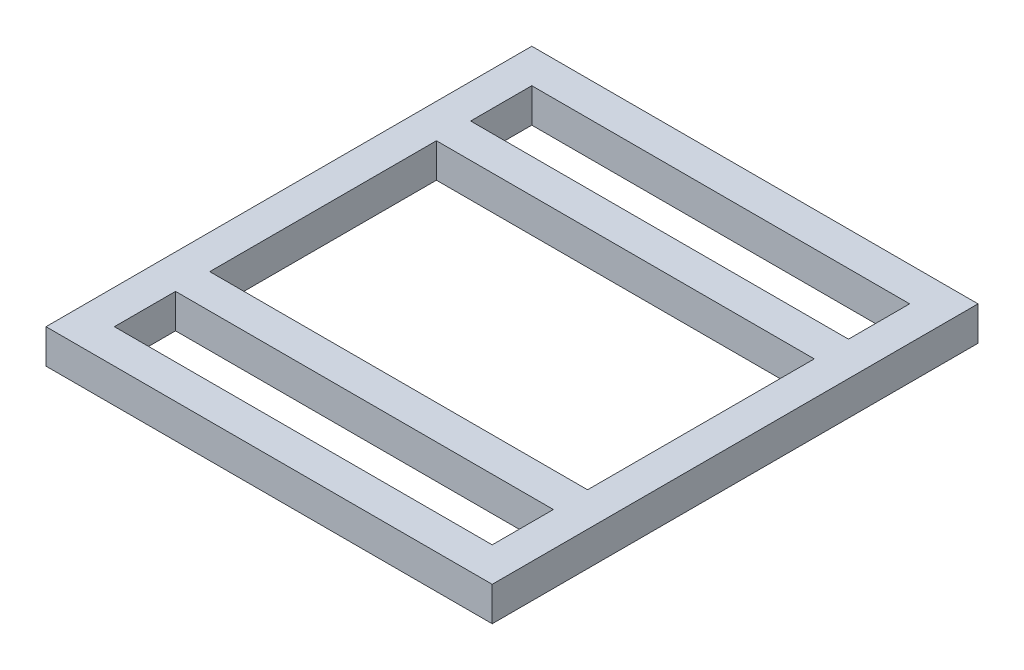
ISO-10303-21;
HEADER;
FILE_DESCRIPTION(('STEP AP214'),'2;1');
FILE_NAME('part.step','',(''),(''),'','','');
FILE_SCHEMA(('AUTOMOTIVE_DESIGN { 1 0 10303 214 1 1 1 1 }'));
ENDSEC;
DATA;
#1=APPLICATION_CONTEXT('core data for automotive mechanical design processes');
#2=APPLICATION_PROTOCOL_DEFINITION('international standard','automotive_design',2000,#1);
#3=PRODUCT_CONTEXT('',#1,'mechanical');
#4=PRODUCT('Part','Part','',(#3));
#5=PRODUCT_RELATED_PRODUCT_CATEGORY('part','',(#4));
#6=PRODUCT_DEFINITION_FORMATION('','',#4);
#7=PRODUCT_DEFINITION_CONTEXT('part definition',#1,'design');
#8=PRODUCT_DEFINITION('design','',#6,#7);
#9=PRODUCT_DEFINITION_SHAPE('','',#8);
#10=(LENGTH_UNIT() NAMED_UNIT(*) SI_UNIT(.MILLI.,.METRE.));
#11=(NAMED_UNIT(*) PLANE_ANGLE_UNIT() SI_UNIT($,.RADIAN.));
#12=(NAMED_UNIT(*) SI_UNIT($,.STERADIAN.) SOLID_ANGLE_UNIT());
#13=UNCERTAINTY_MEASURE_WITH_UNIT(LENGTH_MEASURE(1.E-05),#10,'distance_accuracy_value','');
#14=(GEOMETRIC_REPRESENTATION_CONTEXT(3) GLOBAL_UNCERTAINTY_ASSIGNED_CONTEXT((#13)) GLOBAL_UNIT_ASSIGNED_CONTEXT((#10,
#11,#12)) REPRESENTATION_CONTEXT('',''));
#15=CARTESIAN_POINT('',(0.,0.,0.));
#16=DIRECTION('',(0.,0.,1.));
#17=DIRECTION('',(1.,0.,0.));
#18=AXIS2_PLACEMENT_3D('',#15,#16,#17);
#19=CARTESIAN_POINT('',(0.,19.,0.));
#20=DIRECTION('',(0.,1.,0.));
#21=DIRECTION('',(0.,0.,1.));
#22=AXIS2_PLACEMENT_3D('',#19,#20,#21);
#23=PLANE('',#22);
#24=DIRECTION('',(-1.,0.,0.));
#25=VECTOR('',#24,1.);
#26=CARTESIAN_POINT('',(-25.3350305953817,19.,-191.764705882353));
#27=LINE('',#26,#25);
#28=CARTESIAN_POINT('',(203.664969404618,19.,-191.764705882353));
#29=VERTEX_POINT('',#28);
#30=CARTESIAN_POINT('',(-44.3350305953817,19.,-191.764705882353));
#31=VERTEX_POINT('',#30);
#32=EDGE_CURVE('E248',#29,#31,#27,.T.);
#33=ORIENTED_EDGE('',*,*,#32,.T.);
#34=DIRECTION('',(0.,0.,1.));
#35=VECTOR('',#34,1.);
#36=CARTESIAN_POINT('',(-44.3350305953817,19.,-191.764705882353));
#37=LINE('',#36,#35);
#38=CARTESIAN_POINT('',(-44.3350305953816,19.,78.235294117647));
#39=VERTEX_POINT('',#38);
#40=EDGE_CURVE('E251',#31,#39,#37,.T.);
#41=ORIENTED_EDGE('',*,*,#40,.T.);
#42=DIRECTION('',(1.,0.,0.));
#43=VECTOR('',#42,1.);
#44=CARTESIAN_POINT('',(-44.3350305953816,19.,78.235294117647));
#45=LINE('',#44,#43);
#46=CARTESIAN_POINT('',(203.664969404618,19.,78.235294117647));
#47=VERTEX_POINT('',#46);
#48=EDGE_CURVE('E254',#39,#47,#45,.T.);
#49=ORIENTED_EDGE('',*,*,#48,.T.);
#50=DIRECTION('',(0.,0.,-1.));
#51=VECTOR('',#50,1.);
#52=CARTESIAN_POINT('',(203.664969404618,19.,78.235294117647));
#53=LINE('',#52,#51);
#54=EDGE_CURVE('E256',#47,#29,#53,.T.);
#55=ORIENTED_EDGE('',*,*,#54,.T.);
#56=EDGE_LOOP('',(#33,#41,#49,#55));
#57=FACE_BOUND('',#56,.T.);
#58=DIRECTION('',(0.,0.,1.));
#59=VECTOR('',#58,1.);
#60=CARTESIAN_POINT('',(-25.3350305953816,19.,59.235294117647));
#61=LINE('',#60,#59);
#62=CARTESIAN_POINT('',(-25.3350305953816,19.,25.235294117647));
#63=VERTEX_POINT('',#62);
#64=CARTESIAN_POINT('',(-25.3350305953816,19.,59.235294117647));
#65=VERTEX_POINT('',#64);
#66=EDGE_CURVE('E219',#63,#65,#61,.T.);
#67=ORIENTED_EDGE('',*,*,#66,.F.);
#68=DIRECTION('',(-1.,0.,0.));
#69=VECTOR('',#68,1.);
#70=CARTESIAN_POINT('',(-25.3350305953816,19.,25.235294117647));
#71=LINE('',#70,#69);
#72=CARTESIAN_POINT('',(184.664969404618,19.,25.235294117647));
#73=VERTEX_POINT('',#72);
#74=EDGE_CURVE('E217',#73,#63,#71,.T.);
#75=ORIENTED_EDGE('',*,*,#74,.F.);
#76=DIRECTION('',(0.,0.,-1.));
#77=VECTOR('',#76,1.);
#78=CARTESIAN_POINT('',(184.664969404618,19.,25.235294117647));
#79=LINE('',#78,#77);
#80=CARTESIAN_POINT('',(184.664969404618,19.,59.235294117647));
#81=VERTEX_POINT('',#80);
#82=EDGE_CURVE('E225',#81,#73,#79,.T.);
#83=ORIENTED_EDGE('',*,*,#82,.F.);
#84=DIRECTION('',(1.,0.,0.));
#85=VECTOR('',#84,1.);
#86=CARTESIAN_POINT('',(184.664969404618,19.,59.235294117647));
#87=LINE('',#86,#85);
#88=EDGE_CURVE('E222',#65,#81,#87,.T.);
#89=ORIENTED_EDGE('',*,*,#88,.F.);
#90=EDGE_LOOP('',(#67,#75,#83,#89));
#91=FACE_BOUND('',#90,.T.);
#92=DIRECTION('',(0.,0.,-1.));
#93=VECTOR('',#92,1.);
#94=CARTESIAN_POINT('',(184.664969404618,19.,-172.764705882353));
#95=LINE('',#94,#93);
#96=CARTESIAN_POINT('',(184.664969404618,19.,-138.764705882353));
#97=VERTEX_POINT('',#96);
#98=CARTESIAN_POINT('',(184.664969404618,19.,-172.764705882353));
#99=VERTEX_POINT('',#98);
#100=EDGE_CURVE('E188',#97,#99,#95,.T.);
#101=ORIENTED_EDGE('',*,*,#100,.F.);
#102=DIRECTION('',(1.,0.,0.));
#103=VECTOR('',#102,1.);
#104=CARTESIAN_POINT('',(184.664969404618,19.,-138.764705882353));
#105=LINE('',#104,#103);
#106=CARTESIAN_POINT('',(-25.3350305953817,19.,-138.764705882353));
#107=VERTEX_POINT('',#106);
#108=EDGE_CURVE('E186',#107,#97,#105,.T.);
#109=ORIENTED_EDGE('',*,*,#108,.F.);
#110=DIRECTION('',(0.,0.,1.));
#111=VECTOR('',#110,1.);
#112=CARTESIAN_POINT('',(-25.3350305953817,19.,-138.764705882353));
#113=LINE('',#112,#111);
#114=CARTESIAN_POINT('',(-25.3350305953817,19.,-172.764705882353));
#115=VERTEX_POINT('',#114);
#116=EDGE_CURVE('E194',#115,#107,#113,.T.);
#117=ORIENTED_EDGE('',*,*,#116,.F.);
#118=DIRECTION('',(-1.,0.,0.));
#119=VECTOR('',#118,1.);
#120=CARTESIAN_POINT('',(-25.3350305953817,19.,-172.764705882353));
#121=LINE('',#120,#119);
#122=EDGE_CURVE('E191',#99,#115,#121,.T.);
#123=ORIENTED_EDGE('',*,*,#122,.F.);
#124=EDGE_LOOP('',(#101,#109,#117,#123));
#125=FACE_BOUND('',#124,.T.);
#126=DIRECTION('',(1.,0.,0.));
#127=VECTOR('',#126,1.);
#128=CARTESIAN_POINT('',(184.664969404618,19.,6.23529411764704));
#129=LINE('',#128,#127);
#130=CARTESIAN_POINT('',(-25.3350305953817,19.,6.23529411764707));
#131=VERTEX_POINT('',#130);
#132=CARTESIAN_POINT('',(184.664969404618,19.,6.23529411764704));
#133=VERTEX_POINT('',#132);
#134=EDGE_CURVE('E158',#131,#133,#129,.T.);
#135=ORIENTED_EDGE('',*,*,#134,.F.);
#136=DIRECTION('',(0.,0.,1.));
#137=VECTOR('',#136,1.);
#138=CARTESIAN_POINT('',(-25.3350305953817,19.,6.23529411764707));
#139=LINE('',#138,#137);
#140=CARTESIAN_POINT('',(-25.3350305953816,19.,-119.764705882353));
#141=VERTEX_POINT('',#140);
#142=EDGE_CURVE('E150',#141,#131,#139,.T.);
#143=ORIENTED_EDGE('',*,*,#142,.F.);
#144=DIRECTION('',(-1.,0.,0.));
#145=VECTOR('',#144,1.);
#146=CARTESIAN_POINT('',(-25.3350305953816,19.,-119.764705882353));
#147=LINE('',#146,#145);
#148=CARTESIAN_POINT('',(184.664969404618,19.,-119.764705882353));
#149=VERTEX_POINT('',#148);
#150=EDGE_CURVE('E172',#149,#141,#147,.T.);
#151=ORIENTED_EDGE('',*,*,#150,.F.);
#152=DIRECTION('',(0.,0.,-1.));
#153=VECTOR('',#152,1.);
#154=CARTESIAN_POINT('',(184.664969404618,19.,-119.764705882353));
#155=LINE('',#154,#153);
#156=EDGE_CURVE('E170',#133,#149,#155,.T.);
#157=ORIENTED_EDGE('',*,*,#156,.F.);
#158=EDGE_LOOP('',(#135,#143,#151,#157));
#159=FACE_BOUND('',#158,.T.);
#160=ADVANCED_FACE('F37',(#57,#91,#125,#159),#23,.T.);
#161=CARTESIAN_POINT('',(0.,0.,0.));
#162=DIRECTION('',(0.,1.,0.));
#163=DIRECTION('',(0.,0.,1.));
#164=AXIS2_PLACEMENT_3D('',#161,#162,#163);
#165=PLANE('',#164);
#166=DIRECTION('',(1.,0.,0.));
#167=VECTOR('',#166,1.);
#168=CARTESIAN_POINT('',(184.664969404618,0.,-138.764705882353));
#169=LINE('',#168,#167);
#170=CARTESIAN_POINT('',(-25.3350305953817,0.,-138.764705882353));
#171=VERTEX_POINT('',#170);
#172=CARTESIAN_POINT('',(184.664969404618,0.,-138.764705882353));
#173=VERTEX_POINT('',#172);
#174=EDGE_CURVE('E166',#171,#173,#169,.T.);
#175=ORIENTED_EDGE('',*,*,#174,.T.);
#176=DIRECTION('',(0.,0.,-1.));
#177=VECTOR('',#176,1.);
#178=CARTESIAN_POINT('',(184.664969404618,0.,-172.764705882353));
#179=LINE('',#178,#177);
#180=CARTESIAN_POINT('',(184.664969404618,0.,-172.764705882353));
#181=VERTEX_POINT('',#180);
#182=EDGE_CURVE('E199',#173,#181,#179,.T.);
#183=ORIENTED_EDGE('',*,*,#182,.T.);
#184=DIRECTION('',(-1.,0.,0.));
#185=VECTOR('',#184,1.);
#186=CARTESIAN_POINT('',(-25.3350305953817,0.,-172.764705882353));
#187=LINE('',#186,#185);
#188=CARTESIAN_POINT('',(-25.3350305953817,0.,-172.764705882353));
#189=VERTEX_POINT('',#188);
#190=EDGE_CURVE('E202',#181,#189,#187,.T.);
#191=ORIENTED_EDGE('',*,*,#190,.T.);
#192=DIRECTION('',(0.,0.,1.));
#193=VECTOR('',#192,1.);
#194=CARTESIAN_POINT('',(-25.3350305953817,0.,-138.764705882353));
#195=LINE('',#194,#193);
#196=EDGE_CURVE('E189',#189,#171,#195,.T.);
#197=ORIENTED_EDGE('',*,*,#196,.T.);
#198=EDGE_LOOP('',(#175,#183,#191,#197));
#199=FACE_BOUND('',#198,.T.);
#200=DIRECTION('',(0.,0.,1.));
#201=VECTOR('',#200,1.);
#202=CARTESIAN_POINT('',(-44.3350305953817,0.,-191.764705882353));
#203=LINE('',#202,#201);
#204=CARTESIAN_POINT('',(-44.3350305953817,0.,-191.764705882353));
#205=VERTEX_POINT('',#204);
#206=CARTESIAN_POINT('',(-44.3350305953816,0.,78.235294117647));
#207=VERTEX_POINT('',#206);
#208=EDGE_CURVE('E247',#205,#207,#203,.T.);
#209=ORIENTED_EDGE('',*,*,#208,.F.);
#210=DIRECTION('',(-1.,0.,0.));
#211=VECTOR('',#210,1.);
#212=CARTESIAN_POINT('',(-25.3350305953817,0.,-191.764705882353));
#213=LINE('',#212,#211);
#214=CARTESIAN_POINT('',(203.664969404618,0.,-191.764705882353));
#215=VERTEX_POINT('',#214);
#216=EDGE_CURVE('E252',#215,#205,#213,.T.);
#217=ORIENTED_EDGE('',*,*,#216,.F.);
#218=DIRECTION('',(0.,0.,-1.));
#219=VECTOR('',#218,1.);
#220=CARTESIAN_POINT('',(203.664969404618,0.,78.235294117647));
#221=LINE('',#220,#219);
#222=CARTESIAN_POINT('',(203.664969404618,0.,78.235294117647));
#223=VERTEX_POINT('',#222);
#224=EDGE_CURVE('E264',#223,#215,#221,.T.);
#225=ORIENTED_EDGE('',*,*,#224,.F.);
#226=DIRECTION('',(1.,0.,0.));
#227=VECTOR('',#226,1.);
#228=CARTESIAN_POINT('',(184.664969404618,0.,78.235294117647));
#229=LINE('',#228,#227);
#230=EDGE_CURVE('E262',#207,#223,#229,.T.);
#231=ORIENTED_EDGE('',*,*,#230,.F.);
#232=EDGE_LOOP('',(#209,#217,#225,#231));
#233=FACE_BOUND('',#232,.T.);
#234=DIRECTION('',(-1.,0.,0.));
#235=VECTOR('',#234,1.);
#236=CARTESIAN_POINT('',(-25.3350305953816,0.,25.235294117647));
#237=LINE('',#236,#235);
#238=CARTESIAN_POINT('',(184.664969404618,0.,25.235294117647));
#239=VERTEX_POINT('',#238);
#240=CARTESIAN_POINT('',(-25.3350305953816,0.,25.235294117647));
#241=VERTEX_POINT('',#240);
#242=EDGE_CURVE('E216',#239,#241,#237,.T.);
#243=ORIENTED_EDGE('',*,*,#242,.T.);
#244=DIRECTION('',(0.,0.,1.));
#245=VECTOR('',#244,1.);
#246=CARTESIAN_POINT('',(-25.3350305953816,0.,59.235294117647));
#247=LINE('',#246,#245);
#248=CARTESIAN_POINT('',(-25.3350305953816,0.,59.235294117647));
#249=VERTEX_POINT('',#248);
#250=EDGE_CURVE('E230',#241,#249,#247,.T.);
#251=ORIENTED_EDGE('',*,*,#250,.T.);
#252=DIRECTION('',(1.,0.,0.));
#253=VECTOR('',#252,1.);
#254=CARTESIAN_POINT('',(184.664969404618,0.,59.235294117647));
#255=LINE('',#254,#253);
#256=CARTESIAN_POINT('',(184.664969404618,0.,59.235294117647));
#257=VERTEX_POINT('',#256);
#258=EDGE_CURVE('E233',#249,#257,#255,.T.);
#259=ORIENTED_EDGE('',*,*,#258,.T.);
#260=DIRECTION('',(0.,0.,-1.));
#261=VECTOR('',#260,1.);
#262=CARTESIAN_POINT('',(184.664969404618,0.,25.235294117647));
#263=LINE('',#262,#261);
#264=EDGE_CURVE('E220',#257,#239,#263,.T.);
#265=ORIENTED_EDGE('',*,*,#264,.T.);
#266=EDGE_LOOP('',(#243,#251,#259,#265));
#267=FACE_BOUND('',#266,.T.);
#268=DIRECTION('',(0.,0.,1.));
#269=VECTOR('',#268,1.);
#270=CARTESIAN_POINT('',(-25.3350305953817,0.,6.23529411764707));
#271=LINE('',#270,#269);
#272=CARTESIAN_POINT('',(-25.3350305953816,0.,-119.764705882353));
#273=VERTEX_POINT('',#272);
#274=CARTESIAN_POINT('',(-25.3350305953817,0.,6.23529411764707));
#275=VERTEX_POINT('',#274);
#276=EDGE_CURVE('E60',#273,#275,#271,.T.);
#277=ORIENTED_EDGE('',*,*,#276,.T.);
#278=DIRECTION('',(1.,0.,0.));
#279=VECTOR('',#278,1.);
#280=CARTESIAN_POINT('',(184.664969404618,0.,6.23529411764704));
#281=LINE('',#280,#279);
#282=CARTESIAN_POINT('',(184.664969404618,0.,6.23529411764704));
#283=VERTEX_POINT('',#282);
#284=EDGE_CURVE('E165',#275,#283,#281,.T.);
#285=ORIENTED_EDGE('',*,*,#284,.T.);
#286=DIRECTION('',(0.,0.,-1.));
#287=VECTOR('',#286,1.);
#288=CARTESIAN_POINT('',(184.664969404618,0.,-119.764705882353));
#289=LINE('',#288,#287);
#290=CARTESIAN_POINT('',(184.664969404618,0.,-119.764705882353));
#291=VERTEX_POINT('',#290);
#292=EDGE_CURVE('E178',#283,#291,#289,.T.);
#293=ORIENTED_EDGE('',*,*,#292,.T.);
#294=DIRECTION('',(-1.,0.,0.));
#295=VECTOR('',#294,1.);
#296=CARTESIAN_POINT('',(-25.3350305953816,0.,-119.764705882353));
#297=LINE('',#296,#295);
#298=EDGE_CURVE('E159',#291,#273,#297,.T.);
#299=ORIENTED_EDGE('',*,*,#298,.T.);
#300=EDGE_LOOP('',(#277,#285,#293,#299));
#301=FACE_BOUND('',#300,.T.);
#302=ADVANCED_FACE('F282',(#199,#233,#267,#301),#165,.F.);
#303=CARTESIAN_POINT('',(-44.3350305953817,19.,-191.764705882353));
#304=DIRECTION('',(1.,0.,0.));
#305=DIRECTION('',(0.,0.,-1.));
#306=AXIS2_PLACEMENT_3D('',#303,#304,#305);
#307=PLANE('',#306);
#308=ORIENTED_EDGE('',*,*,#208,.T.);
#309=DIRECTION('',(0.,-1.,0.));
#310=VECTOR('',#309,1.);
#311=CARTESIAN_POINT('',(-44.3350305953816,19.,78.235294117647));
#312=LINE('',#311,#310);
#313=EDGE_CURVE('E45',#39,#207,#312,.T.);
#314=ORIENTED_EDGE('',*,*,#313,.F.);
#315=ORIENTED_EDGE('',*,*,#40,.F.);
#316=DIRECTION('',(0.,-1.,0.));
#317=VECTOR('',#316,1.);
#318=CARTESIAN_POINT('',(-44.3350305953817,19.,-191.764705882353));
#319=LINE('',#318,#317);
#320=EDGE_CURVE('E11',#31,#205,#319,.T.);
#321=ORIENTED_EDGE('',*,*,#320,.T.);
#322=EDGE_LOOP('',(#308,#314,#315,#321));
#323=FACE_BOUND('',#322,.T.);
#324=ADVANCED_FACE('F39',(#323),#307,.F.);
#325=CARTESIAN_POINT('',(184.664969404618,19.,78.235294117647));
#326=DIRECTION('',(0.,0.,-1.));
#327=DIRECTION('',(-1.,0.,0.));
#328=AXIS2_PLACEMENT_3D('',#325,#326,#327);
#329=PLANE('',#328);
#330=ORIENTED_EDGE('',*,*,#230,.T.);
#331=DIRECTION('',(0.,-1.,0.));
#332=VECTOR('',#331,1.);
#333=CARTESIAN_POINT('',(203.664969404618,19.,78.235294117647));
#334=LINE('',#333,#332);
#335=EDGE_CURVE('E270',#47,#223,#334,.T.);
#336=ORIENTED_EDGE('',*,*,#335,.F.);
#337=ORIENTED_EDGE('',*,*,#48,.F.);
#338=ORIENTED_EDGE('',*,*,#313,.T.);
#339=EDGE_LOOP('',(#330,#336,#337,#338));
#340=FACE_BOUND('',#339,.T.);
#341=ADVANCED_FACE('F276',(#340),#329,.F.);
#342=CARTESIAN_POINT('',(203.664969404618,19.,78.235294117647));
#343=DIRECTION('',(-1.,0.,0.));
#344=DIRECTION('',(0.,0.,1.));
#345=AXIS2_PLACEMENT_3D('',#342,#343,#344);
#346=PLANE('',#345);
#347=ORIENTED_EDGE('',*,*,#224,.T.);
#348=DIRECTION('',(0.,-1.,0.));
#349=VECTOR('',#348,1.);
#350=CARTESIAN_POINT('',(203.664969404618,19.,-191.764705882353));
#351=LINE('',#350,#349);
#352=EDGE_CURVE('E259',#29,#215,#351,.T.);
#353=ORIENTED_EDGE('',*,*,#352,.F.);
#354=ORIENTED_EDGE('',*,*,#54,.F.);
#355=ORIENTED_EDGE('',*,*,#335,.T.);
#356=EDGE_LOOP('',(#347,#353,#354,#355));
#357=FACE_BOUND('',#356,.T.);
#358=ADVANCED_FACE('F287',(#357),#346,.F.);
#359=CARTESIAN_POINT('',(-25.3350305953817,19.,-191.764705882353));
#360=DIRECTION('',(0.,0.,1.));
#361=DIRECTION('',(1.,0.,0.));
#362=AXIS2_PLACEMENT_3D('',#359,#360,#361);
#363=PLANE('',#362);
#364=ORIENTED_EDGE('',*,*,#216,.T.);
#365=ORIENTED_EDGE('',*,*,#320,.F.);
#366=ORIENTED_EDGE('',*,*,#32,.F.);
#367=ORIENTED_EDGE('',*,*,#352,.T.);
#368=EDGE_LOOP('',(#364,#365,#366,#367));
#369=FACE_BOUND('',#368,.T.);
#370=ADVANCED_FACE('F290',(#369),#363,.F.);
#371=CARTESIAN_POINT('',(-25.3350305953816,19.,25.235294117647));
#372=DIRECTION('',(0.,0.,1.));
#373=DIRECTION('',(1.,0.,0.));
#374=AXIS2_PLACEMENT_3D('',#371,#372,#373);
#375=PLANE('',#374);
#376=ORIENTED_EDGE('',*,*,#242,.F.);
#377=DIRECTION('',(0.,-1.,0.));
#378=VECTOR('',#377,1.);
#379=CARTESIAN_POINT('',(184.664969404618,19.,25.235294117647));
#380=LINE('',#379,#378);
#381=EDGE_CURVE('E227',#73,#239,#380,.T.);
#382=ORIENTED_EDGE('',*,*,#381,.F.);
#383=ORIENTED_EDGE('',*,*,#74,.T.);
#384=DIRECTION('',(0.,-1.,0.));
#385=VECTOR('',#384,1.);
#386=CARTESIAN_POINT('',(-25.3350305953816,19.,25.235294117647));
#387=LINE('',#386,#385);
#388=EDGE_CURVE('E244',#63,#241,#387,.T.);
#389=ORIENTED_EDGE('',*,*,#388,.T.);
#390=EDGE_LOOP('',(#376,#382,#383,#389));
#391=FACE_BOUND('',#390,.T.);
#392=ADVANCED_FACE('F342',(#391),#375,.T.);
#393=CARTESIAN_POINT('',(-25.3350305953816,19.,59.235294117647));
#394=DIRECTION('',(1.,0.,0.));
#395=DIRECTION('',(0.,0.,-1.));
#396=AXIS2_PLACEMENT_3D('',#393,#394,#395);
#397=PLANE('',#396);
#398=ORIENTED_EDGE('',*,*,#250,.F.);
#399=ORIENTED_EDGE('',*,*,#388,.F.);
#400=ORIENTED_EDGE('',*,*,#66,.T.);
#401=DIRECTION('',(0.,-1.,0.));
#402=VECTOR('',#401,1.);
#403=CARTESIAN_POINT('',(-25.3350305953816,19.,59.235294117647));
#404=LINE('',#403,#402);
#405=EDGE_CURVE('E242',#65,#249,#404,.T.);
#406=ORIENTED_EDGE('',*,*,#405,.T.);
#407=EDGE_LOOP('',(#398,#399,#400,#406));
#408=FACE_BOUND('',#407,.T.);
#409=ADVANCED_FACE('F338',(#408),#397,.T.);
#410=CARTESIAN_POINT('',(184.664969404618,19.,59.235294117647));
#411=DIRECTION('',(0.,0.,-1.));
#412=DIRECTION('',(-1.,0.,0.));
#413=AXIS2_PLACEMENT_3D('',#410,#411,#412);
#414=PLANE('',#413);
#415=ORIENTED_EDGE('',*,*,#258,.F.);
#416=ORIENTED_EDGE('',*,*,#405,.F.);
#417=ORIENTED_EDGE('',*,*,#88,.T.);
#418=DIRECTION('',(0.,-1.,0.));
#419=VECTOR('',#418,1.);
#420=CARTESIAN_POINT('',(184.664969404618,19.,59.235294117647));
#421=LINE('',#420,#419);
#422=EDGE_CURVE('E240',#81,#257,#421,.T.);
#423=ORIENTED_EDGE('',*,*,#422,.T.);
#424=EDGE_LOOP('',(#415,#416,#417,#423));
#425=FACE_BOUND('',#424,.T.);
#426=ADVANCED_FACE('F334',(#425),#414,.T.);
#427=CARTESIAN_POINT('',(184.664969404618,19.,25.235294117647));
#428=DIRECTION('',(-1.,0.,0.));
#429=DIRECTION('',(0.,0.,1.));
#430=AXIS2_PLACEMENT_3D('',#427,#428,#429);
#431=PLANE('',#430);
#432=ORIENTED_EDGE('',*,*,#264,.F.);
#433=ORIENTED_EDGE('',*,*,#422,.F.);
#434=ORIENTED_EDGE('',*,*,#82,.T.);
#435=ORIENTED_EDGE('',*,*,#381,.T.);
#436=EDGE_LOOP('',(#432,#433,#434,#435));
#437=FACE_BOUND('',#436,.T.);
#438=ADVANCED_FACE('F331',(#437),#431,.T.);
#439=CARTESIAN_POINT('',(184.664969404618,19.,-138.764705882353));
#440=DIRECTION('',(0.,0.,-1.));
#441=DIRECTION('',(-1.,0.,0.));
#442=AXIS2_PLACEMENT_3D('',#439,#440,#441);
#443=PLANE('',#442);
#444=ORIENTED_EDGE('',*,*,#174,.F.);
#445=DIRECTION('',(0.,-1.,0.));
#446=VECTOR('',#445,1.);
#447=CARTESIAN_POINT('',(-25.3350305953817,19.,-138.764705882353));
#448=LINE('',#447,#446);
#449=EDGE_CURVE('E196',#107,#171,#448,.T.);
#450=ORIENTED_EDGE('',*,*,#449,.F.);
#451=ORIENTED_EDGE('',*,*,#108,.T.);
#452=DIRECTION('',(0.,-1.,0.));
#453=VECTOR('',#452,1.);
#454=CARTESIAN_POINT('',(184.664969404618,19.,-138.764705882353));
#455=LINE('',#454,#453);
#456=EDGE_CURVE('E213',#97,#173,#455,.T.);
#457=ORIENTED_EDGE('',*,*,#456,.T.);
#458=EDGE_LOOP('',(#444,#450,#451,#457));
#459=FACE_BOUND('',#458,.T.);
#460=ADVANCED_FACE('F313',(#459),#443,.T.);
#461=CARTESIAN_POINT('',(184.664969404618,19.,-172.764705882353));
#462=DIRECTION('',(-1.,0.,0.));
#463=DIRECTION('',(0.,0.,1.));
#464=AXIS2_PLACEMENT_3D('',#461,#462,#463);
#465=PLANE('',#464);
#466=ORIENTED_EDGE('',*,*,#182,.F.);
#467=ORIENTED_EDGE('',*,*,#456,.F.);
#468=ORIENTED_EDGE('',*,*,#100,.T.);
#469=DIRECTION('',(0.,-1.,0.));
#470=VECTOR('',#469,1.);
#471=CARTESIAN_POINT('',(184.664969404618,19.,-172.764705882353));
#472=LINE('',#471,#470);
#473=EDGE_CURVE('E211',#99,#181,#472,.T.);
#474=ORIENTED_EDGE('',*,*,#473,.T.);
#475=EDGE_LOOP('',(#466,#467,#468,#474));
#476=FACE_BOUND('',#475,.T.);
#477=ADVANCED_FACE('F306',(#476),#465,.T.);
#478=CARTESIAN_POINT('',(-25.3350305953817,19.,-172.764705882353));
#479=DIRECTION('',(0.,0.,1.));
#480=DIRECTION('',(1.,0.,0.));
#481=AXIS2_PLACEMENT_3D('',#478,#479,#480);
#482=PLANE('',#481);
#483=ORIENTED_EDGE('',*,*,#190,.F.);
#484=ORIENTED_EDGE('',*,*,#473,.F.);
#485=ORIENTED_EDGE('',*,*,#122,.T.);
#486=DIRECTION('',(0.,-1.,0.));
#487=VECTOR('',#486,1.);
#488=CARTESIAN_POINT('',(-25.3350305953817,19.,-172.764705882353));
#489=LINE('',#488,#487);
#490=EDGE_CURVE('E209',#115,#189,#489,.T.);
#491=ORIENTED_EDGE('',*,*,#490,.T.);
#492=EDGE_LOOP('',(#483,#484,#485,#491));
#493=FACE_BOUND('',#492,.T.);
#494=ADVANCED_FACE('F309',(#493),#482,.T.);
#495=CARTESIAN_POINT('',(-25.3350305953817,19.,-138.764705882353));
#496=DIRECTION('',(1.,0.,0.));
#497=DIRECTION('',(0.,0.,-1.));
#498=AXIS2_PLACEMENT_3D('',#495,#496,#497);
#499=PLANE('',#498);
#500=ORIENTED_EDGE('',*,*,#196,.F.);
#501=ORIENTED_EDGE('',*,*,#490,.F.);
#502=ORIENTED_EDGE('',*,*,#116,.T.);
#503=ORIENTED_EDGE('',*,*,#449,.T.);
#504=EDGE_LOOP('',(#500,#501,#502,#503));
#505=FACE_BOUND('',#504,.T.);
#506=ADVANCED_FACE('F316',(#505),#499,.T.);
#507=CARTESIAN_POINT('',(-25.3350305953817,19.,6.23529411764707));
#508=DIRECTION('',(1.,0.,0.));
#509=DIRECTION('',(0.,0.,-1.));
#510=AXIS2_PLACEMENT_3D('',#507,#508,#509);
#511=PLANE('',#510);
#512=ORIENTED_EDGE('',*,*,#276,.F.);
#513=DIRECTION('',(0.,-1.,0.));
#514=VECTOR('',#513,1.);
#515=CARTESIAN_POINT('',(-25.3350305953816,19.,-119.764705882353));
#516=LINE('',#515,#514);
#517=EDGE_CURVE('E154',#141,#273,#516,.T.);
#518=ORIENTED_EDGE('',*,*,#517,.F.);
#519=ORIENTED_EDGE('',*,*,#142,.T.);
#520=DIRECTION('',(0.,-1.,0.));
#521=VECTOR('',#520,1.);
#522=CARTESIAN_POINT('',(-25.3350305953817,19.,6.23529411764707));
#523=LINE('',#522,#521);
#524=EDGE_CURVE('E153',#131,#275,#523,.T.);
#525=ORIENTED_EDGE('',*,*,#524,.T.);
#526=EDGE_LOOP('',(#512,#518,#519,#525));
#527=FACE_BOUND('',#526,.T.);
#528=ADVANCED_FACE('F152',(#527),#511,.T.);
#529=CARTESIAN_POINT('',(184.664969404618,19.,6.23529411764704));
#530=DIRECTION('',(0.,0.,-1.));
#531=DIRECTION('',(-1.,0.,0.));
#532=AXIS2_PLACEMENT_3D('',#529,#530,#531);
#533=PLANE('',#532);
#534=ORIENTED_EDGE('',*,*,#284,.F.);
#535=ORIENTED_EDGE('',*,*,#524,.F.);
#536=ORIENTED_EDGE('',*,*,#134,.T.);
#537=DIRECTION('',(0.,-1.,0.));
#538=VECTOR('',#537,1.);
#539=CARTESIAN_POINT('',(184.664969404618,19.,6.23529411764704));
#540=LINE('',#539,#538);
#541=EDGE_CURVE('E167',#133,#283,#540,.T.);
#542=ORIENTED_EDGE('',*,*,#541,.T.);
#543=EDGE_LOOP('',(#534,#535,#536,#542));
#544=FACE_BOUND('',#543,.T.);
#545=ADVANCED_FACE('F162',(#544),#533,.T.);
#546=CARTESIAN_POINT('',(184.664969404618,19.,-119.764705882353));
#547=DIRECTION('',(-1.,0.,0.));
#548=DIRECTION('',(0.,0.,1.));
#549=AXIS2_PLACEMENT_3D('',#546,#547,#548);
#550=PLANE('',#549);
#551=ORIENTED_EDGE('',*,*,#292,.F.);
#552=ORIENTED_EDGE('',*,*,#541,.F.);
#553=ORIENTED_EDGE('',*,*,#156,.T.);
#554=DIRECTION('',(0.,-1.,0.));
#555=VECTOR('',#554,1.);
#556=CARTESIAN_POINT('',(184.664969404618,19.,-119.764705882353));
#557=LINE('',#556,#555);
#558=EDGE_CURVE('E52',#149,#291,#557,.T.);
#559=ORIENTED_EDGE('',*,*,#558,.T.);
#560=EDGE_LOOP('',(#551,#552,#553,#559));
#561=FACE_BOUND('',#560,.T.);
#562=ADVANCED_FACE('F450',(#561),#550,.T.);
#563=CARTESIAN_POINT('',(-25.3350305953816,19.,-119.764705882353));
#564=DIRECTION('',(0.,0.,1.));
#565=DIRECTION('',(1.,0.,0.));
#566=AXIS2_PLACEMENT_3D('',#563,#564,#565);
#567=PLANE('',#566);
#568=ORIENTED_EDGE('',*,*,#298,.F.);
#569=ORIENTED_EDGE('',*,*,#558,.F.);
#570=ORIENTED_EDGE('',*,*,#150,.T.);
#571=ORIENTED_EDGE('',*,*,#517,.T.);
#572=EDGE_LOOP('',(#568,#569,#570,#571));
#573=FACE_BOUND('',#572,.T.);
#574=ADVANCED_FACE('F457',(#573),#567,.T.);
#575=CLOSED_SHELL('',(#160,#302,#324,#341,#358,#370,#392,#409,#426,#438,#460,#477,#494,#506,
#528,#545,#562,#574));
#576=MANIFOLD_SOLID_BREP('B2',#575);
#577=ADVANCED_BREP_SHAPE_REPRESENTATION('',(#18,#576),#14);
#578=SHAPE_DEFINITION_REPRESENTATION(#9,#577);
ENDSEC;
END-ISO-10303-21;
